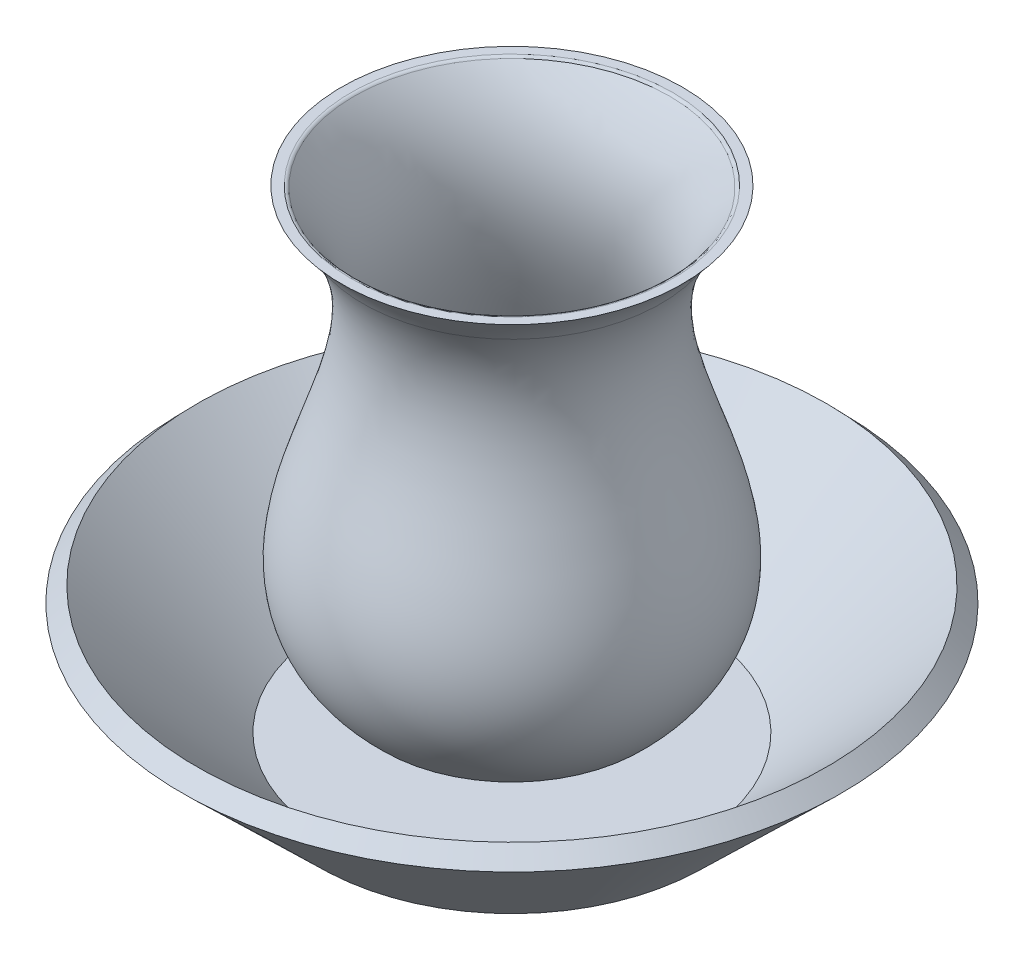
ISO-10303-21;
HEADER;
FILE_DESCRIPTION(('STEP AP214'),'2;1');
FILE_NAME('part.step','',(''),(''),'','','');
FILE_SCHEMA(('AUTOMOTIVE_DESIGN { 1 0 10303 214 1 1 1 1 }'));
ENDSEC;
DATA;
#1=APPLICATION_CONTEXT('core data for automotive mechanical design processes');
#2=APPLICATION_PROTOCOL_DEFINITION('international standard','automotive_design',2000,#1);
#3=PRODUCT_CONTEXT('',#1,'mechanical');
#4=PRODUCT('Part','Part','',(#3));
#5=PRODUCT_RELATED_PRODUCT_CATEGORY('part','',(#4));
#6=PRODUCT_DEFINITION_FORMATION('','',#4);
#7=PRODUCT_DEFINITION_CONTEXT('part definition',#1,'design');
#8=PRODUCT_DEFINITION('design','',#6,#7);
#9=PRODUCT_DEFINITION_SHAPE('','',#8);
#10=(LENGTH_UNIT() NAMED_UNIT(*) SI_UNIT(.MILLI.,.METRE.));
#11=(NAMED_UNIT(*) PLANE_ANGLE_UNIT() SI_UNIT($,.RADIAN.));
#12=(NAMED_UNIT(*) SI_UNIT($,.STERADIAN.) SOLID_ANGLE_UNIT());
#13=UNCERTAINTY_MEASURE_WITH_UNIT(LENGTH_MEASURE(1.E-05),#10,'distance_accuracy_value','');
#14=(GEOMETRIC_REPRESENTATION_CONTEXT(3) GLOBAL_UNCERTAINTY_ASSIGNED_CONTEXT((#13)) GLOBAL_UNIT_ASSIGNED_CONTEXT((#10,
#11,#12)) REPRESENTATION_CONTEXT('',''));
#15=CARTESIAN_POINT('',(0.,0.,0.));
#16=DIRECTION('',(0.,0.,1.));
#17=DIRECTION('',(1.,0.,0.));
#18=AXIS2_PLACEMENT_3D('',#15,#16,#17);
#19=CARTESIAN_POINT('',(0.,-11.1251683381365,0.));
#20=DIRECTION('',(0.,1.,0.));
#21=DIRECTION('',(0.,0.,1.));
#22=AXIS2_PLACEMENT_3D('',#19,#20,#21);
#23=CONICAL_SURFACE('',#22,42.9753582554153,0.801300885954638);
#24=CARTESIAN_POINT('',(0.,18.7759222332208,0.));
#25=DIRECTION('',(0.,-1.,0.));
#26=DIRECTION('',(0.,0.,-1.));
#27=AXIS2_PLACEMENT_3D('',#24,#25,#26);
#28=CIRCLE('',#27,73.8429172749553);
#29=CARTESIAN_POINT('',(0.,18.7759222332208,-73.8429172749553));
#30=VERTEX_POINT('',#29);
#31=EDGE_CURVE('E55',#30,#30,#28,.T.);
#32=ORIENTED_EDGE('',*,*,#31,.F.);
#33=EDGE_LOOP('',(#32));
#34=FACE_BOUND('',#33,.T.);
#35=CARTESIAN_POINT('',(0.,-11.1251683381365,0.));
#36=DIRECTION('',(0.,-1.,0.));
#37=DIRECTION('',(0.,0.,-1.));
#38=AXIS2_PLACEMENT_3D('',#35,#36,#37);
#39=CIRCLE('',#38,42.9753582554153);
#40=CARTESIAN_POINT('',(0.,-11.1251683381365,-42.9753582554153));
#41=VERTEX_POINT('',#40);
#42=EDGE_CURVE('E12',#41,#41,#39,.T.);
#43=ORIENTED_EDGE('',*,*,#42,.T.);
#44=EDGE_LOOP('',(#43));
#45=FACE_BOUND('',#44,.T.);
#46=ADVANCED_FACE('F41',(#34,#45),#23,.F.);
#47=CARTESIAN_POINT('',(0.,-11.1251683381365,0.));
#48=DIRECTION('',(0.,-1.,0.));
#49=DIRECTION('',(0.,0.,-1.));
#50=AXIS2_PLACEMENT_3D('',#47,#48,#49);
#51=PLANE('',#50);
#52=ORIENTED_EDGE('',*,*,#42,.F.);
#53=EDGE_LOOP('',(#52));
#54=FACE_BOUND('',#53,.T.);
#55=ADVANCED_FACE('F65',(#54),#51,.F.);
#56=CARTESIAN_POINT('',(0.,-16.1251683381365,0.));
#57=DIRECTION('',(0.,-1.,0.));
#58=DIRECTION('',(0.,0.,-1.));
#59=AXIS2_PLACEMENT_3D('',#56,#57,#58);
#60=PLANE('',#59);
#61=CARTESIAN_POINT('',(0.,-16.1251683381365,0.));
#62=DIRECTION('',(0.,-1.,0.));
#63=DIRECTION('',(0.,0.,-1.));
#64=AXIS2_PLACEMENT_3D('',#61,#62,#63);
#65=CIRCLE('',#64,45.);
#66=CARTESIAN_POINT('',(0.,-16.1251683381365,-45.));
#67=VERTEX_POINT('',#66);
#68=EDGE_CURVE('E47',#67,#67,#65,.T.);
#69=ORIENTED_EDGE('',*,*,#68,.T.);
#70=EDGE_LOOP('',(#69));
#71=FACE_BOUND('',#70,.T.);
#72=ADVANCED_FACE('F69',(#71),#60,.T.);
#73=CARTESIAN_POINT('',(0.,-16.1251683381365,0.));
#74=DIRECTION('',(0.,1.,0.));
#75=DIRECTION('',(0.,0.,1.));
#76=AXIS2_PLACEMENT_3D('',#73,#74,#75);
#77=CONICAL_SURFACE('',#76,45.,0.801300885954638);
#78=CARTESIAN_POINT('',(0.,15.1846131350994,0.));
#79=DIRECTION('',(0.,-1.,0.));
#80=DIRECTION('',(0.,0.,-1.));
#81=AXIS2_PLACEMENT_3D('',#78,#79,#80);
#82=CIRCLE('',#81,77.3217818830926);
#83=CARTESIAN_POINT('',(0.,15.1846131350994,-77.3217818830926));
#84=VERTEX_POINT('',#83);
#85=EDGE_CURVE('E51',#84,#84,#82,.T.);
#86=ORIENTED_EDGE('',*,*,#85,.T.);
#87=EDGE_LOOP('',(#86));
#88=FACE_BOUND('',#87,.T.);
#89=ORIENTED_EDGE('',*,*,#68,.F.);
#90=EDGE_LOOP('',(#89));
#91=FACE_BOUND('',#90,.T.);
#92=ADVANCED_FACE('F74',(#88,#91),#77,.T.);
#93=CARTESIAN_POINT('',(0.,15.1846131350994,0.));
#94=DIRECTION('',(0.,-1.,0.));
#95=DIRECTION('',(0.,0.,-1.));
#96=AXIS2_PLACEMENT_3D('',#93,#94,#95);
#97=CONICAL_SURFACE('',#96,77.3217818830926,0.769495440840256);
#98=ORIENTED_EDGE('',*,*,#31,.T.);
#99=EDGE_LOOP('',(#98));
#100=FACE_BOUND('',#99,.T.);
#101=ORIENTED_EDGE('',*,*,#85,.F.);
#102=EDGE_LOOP('',(#101));
#103=FACE_BOUND('',#102,.T.);
#104=ADVANCED_FACE('F61',(#100,#103),#97,.T.);
#105=CLOSED_SHELL('',(#46,#55,#72,#92,#104));
#106=MANIFOLD_SOLID_BREP('B2',#105);
#107=CARTESIAN_POINT('',(30.,0.,0.));
#108=CARTESIAN_POINT('',(63.6299733814836,31.7031630259168,0.));
#109=CARTESIAN_POINT('',(8.21429828910841,65.6763658658362,0.));
#110=CARTESIAN_POINT('',(40.,100.,0.));
#111=B_SPLINE_CURVE_WITH_KNOTS('',3,(#107,#108,#109,#110),.UNSPECIFIED.,.F.,.F.,(4,4),(0.,1.),.UNSPECIFIED.);
#112=CARTESIAN_POINT('',(0.,0.,0.));
#113=DIRECTION('',(0.,-1.,0.));
#114=AXIS1_PLACEMENT('',#112,#113);
#115=SURFACE_OF_REVOLUTION('',#111,#114);
#116=CARTESIAN_POINT('',(0.,0.,0.));
#117=DIRECTION('',(0.,-1.,0.));
#118=DIRECTION('',(0.,0.,-1.));
#119=AXIS2_PLACEMENT_3D('',#116,#117,#118);
#120=CIRCLE('',#119,30.);
#121=CARTESIAN_POINT('',(0.,0.,-30.));
#122=VERTEX_POINT('',#121);
#123=EDGE_CURVE('E150',#122,#122,#120,.T.);
#124=ORIENTED_EDGE('',*,*,#123,.F.);
#125=EDGE_LOOP('',(#124));
#126=FACE_BOUND('',#125,.T.);
#127=CARTESIAN_POINT('',(0.,93.4586613205445,0.));
#128=DIRECTION('',(0.,-1.,0.));
#129=DIRECTION('',(0.,0.,-1.));
#130=AXIS2_PLACEMENT_3D('',#127,#128,#129);
#131=CIRCLE('',#130,34.9499145074642);
#132=CARTESIAN_POINT('',(0.,93.4586613205445,-34.9499145074642));
#133=VERTEX_POINT('',#132);
#134=EDGE_CURVE('E40',#133,#133,#131,.T.);
#135=ORIENTED_EDGE('',*,*,#134,.T.);
#136=EDGE_LOOP('',(#135));
#137=FACE_BOUND('',#136,.T.);
#138=ADVANCED_FACE('F124',(#126,#137),#115,.F.);
#139=CARTESIAN_POINT('',(40.,100.,0.));
#140=DIRECTION('',(0.,1.,0.));
#141=DIRECTION('',(0.,0.,1.));
#142=AXIS2_PLACEMENT_3D('',#139,#140,#141);
#143=PLANE('',#142);
#144=CARTESIAN_POINT('',(0.,100.,0.));
#145=DIRECTION('',(0.,1.,0.));
#146=DIRECTION('',(0.,0.,1.));
#147=AXIS2_PLACEMENT_3D('',#144,#145,#146);
#148=CIRCLE('',#147,37.7782619473767);
#149=CARTESIAN_POINT('',(0.,100.,37.7782619473767));
#150=VERTEX_POINT('',#149);
#151=EDGE_CURVE('E131',#150,#150,#148,.F.);
#152=ORIENTED_EDGE('',*,*,#151,.T.);
#153=EDGE_LOOP('',(#152));
#154=FACE_BOUND('',#153,.T.);
#155=CARTESIAN_POINT('',(0.,100.,0.));
#156=DIRECTION('',(0.,-1.,0.));
#157=DIRECTION('',(0.,0.,-1.));
#158=AXIS2_PLACEMENT_3D('',#155,#156,#157);
#159=CIRCLE('',#158,40.);
#160=CARTESIAN_POINT('',(0.,100.,-40.));
#161=VERTEX_POINT('',#160);
#162=EDGE_CURVE('E147',#161,#161,#159,.T.);
#163=ORIENTED_EDGE('',*,*,#162,.F.);
#164=EDGE_LOOP('',(#163));
#165=FACE_BOUND('',#164,.T.);
#166=ADVANCED_FACE('F166',(#154,#165),#143,.T.);
#167=ORIENTED_EDGE('',*,*,#134,.F.);
#168=EDGE_LOOP('',(#167));
#169=FACE_BOUND('',#168,.T.);
#170=ORIENTED_EDGE('',*,*,#162,.T.);
#171=EDGE_LOOP('',(#170));
#172=FACE_BOUND('',#171,.T.);
#173=ADVANCED_FACE('F160',(#169,#172),#115,.F.);
#174=CARTESIAN_POINT('',(30.,0.,0.));
#175=DIRECTION('',(0.,-1.,0.));
#176=DIRECTION('',(0.,0.,-1.));
#177=AXIS2_PLACEMENT_3D('',#174,#175,#176);
#178=PLANE('',#177);
#179=ORIENTED_EDGE('',*,*,#123,.T.);
#180=EDGE_LOOP('',(#179));
#181=FACE_BOUND('',#180,.T.);
#182=ADVANCED_FACE('F165',(#181),#178,.T.);
#183=CARTESIAN_POINT('',(30.,0.,0.));
#184=CARTESIAN_POINT('',(63.6299733814836,31.7031630259168,0.));
#185=CARTESIAN_POINT('',(8.21429828910841,65.6763658658362,0.));
#186=CARTESIAN_POINT('',(40.,100.,0.));
#187=B_SPLINE_CURVE_WITH_KNOTS('',3,(#183,#184,#185,#186),.UNSPECIFIED.,.F.,.F.,(4,4),(0.,1.),.UNSPECIFIED.);
#188=CARTESIAN_POINT('',(0.,0.,0.));
#189=DIRECTION('',(0.,-1.,0.));
#190=AXIS1_PLACEMENT('',#188,#189);
#191=SURFACE_OF_REVOLUTION('',#187,#190);
#192=OFFSET_SURFACE('',#191,2.,.F.);
#193=CARTESIAN_POINT('',(0.,2.28987318492507,0.));
#194=DIRECTION('',(0.,-1.,0.));
#195=DIRECTION('',(0.,0.,-1.));
#196=AXIS2_PLACEMENT_3D('',#193,#194,#195);
#197=CIRCLE('',#196,29.4915535836188);
#198=CARTESIAN_POINT('',(0.,2.28987318492507,-29.4915535836188));
#199=VERTEX_POINT('',#198);
#200=EDGE_CURVE('E139',#199,#199,#197,.T.);
#201=ORIENTED_EDGE('',*,*,#200,.T.);
#202=EDGE_LOOP('',(#201));
#203=FACE_BOUND('',#202,.T.);
#204=CARTESIAN_POINT('',(0.,99.6460609866268,0.));
#205=DIRECTION('',(0.,-1.,0.));
#206=DIRECTION('',(0.,0.,-1.));
#207=AXIS2_PLACEMENT_3D('',#204,#205,#206);
#208=CIRCLE('',#207,37.0149761545318);
#209=CARTESIAN_POINT('',(0.,99.6460609866268,-37.0149761545318));
#210=VERTEX_POINT('',#209);
#211=EDGE_CURVE('E144',#210,#210,#208,.F.);
#212=ORIENTED_EDGE('',*,*,#211,.T.);
#213=EDGE_LOOP('',(#212));
#214=FACE_BOUND('',#213,.T.);
#215=ADVANCED_FACE('F168',(#203,#214),#192,.T.);
#216=CARTESIAN_POINT('',(30.,2.,0.));
#217=DIRECTION('',(0.,-1.,0.));
#218=DIRECTION('',(0.,0.,-1.));
#219=AXIS2_PLACEMENT_3D('',#216,#217,#218);
#220=PLANE('',#219);
#221=CARTESIAN_POINT('',(0.,2.,0.));
#222=DIRECTION('',(0.,-1.,0.));
#223=DIRECTION('',(0.,0.,-1.));
#224=AXIS2_PLACEMENT_3D('',#221,#222,#223);
#225=CIRCLE('',#224,28.787479790248);
#226=CARTESIAN_POINT('',(0.,2.,-28.787479790248));
#227=VERTEX_POINT('',#226);
#228=EDGE_CURVE('E135',#227,#227,#225,.F.);
#229=ORIENTED_EDGE('',*,*,#228,.T.);
#230=EDGE_LOOP('',(#229));
#231=FACE_BOUND('',#230,.T.);
#232=ADVANCED_FACE('F169',(#231),#220,.F.);
#233=CARTESIAN_POINT('',(0.,3.,0.));
#234=DIRECTION('',(0.,-1.,0.));
#235=DIRECTION('',(0.,0.,-1.));
#236=AXIS2_PLACEMENT_3D('',#233,#234,#235);
#237=TOROIDAL_SURFACE('',#236,28.787479790248,1.);
#238=ORIENTED_EDGE('',*,*,#228,.F.);
#239=EDGE_LOOP('',(#238));
#240=FACE_BOUND('',#239,.T.);
#241=ORIENTED_EDGE('',*,*,#200,.F.);
#242=EDGE_LOOP('',(#241));
#243=FACE_BOUND('',#242,.T.);
#244=ADVANCED_FACE('F172',(#240,#243),#237,.F.);
#245=CARTESIAN_POINT('',(0.,99.,0.));
#246=DIRECTION('',(0.,-1.,0.));
#247=DIRECTION('',(0.,0.,-1.));
#248=AXIS2_PLACEMENT_3D('',#245,#246,#247);
#249=TOROIDAL_SURFACE('',#248,37.7782619473767,1.);
#250=ORIENTED_EDGE('',*,*,#211,.F.);
#251=EDGE_LOOP('',(#250));
#252=FACE_BOUND('',#251,.T.);
#253=ORIENTED_EDGE('',*,*,#151,.F.);
#254=EDGE_LOOP('',(#253));
#255=FACE_BOUND('',#254,.T.);
#256=ADVANCED_FACE('F126',(#252,#255),#249,.T.);
#257=CLOSED_SHELL('',(#138,#166,#173,#182,#215,#232,#244,#256));
#258=MANIFOLD_SOLID_BREP('B7',#257);
#259=ADVANCED_BREP_SHAPE_REPRESENTATION('',(#18,#106,#258),#14);
#260=SHAPE_DEFINITION_REPRESENTATION(#9,#259);
ENDSEC;
END-ISO-10303-21;
